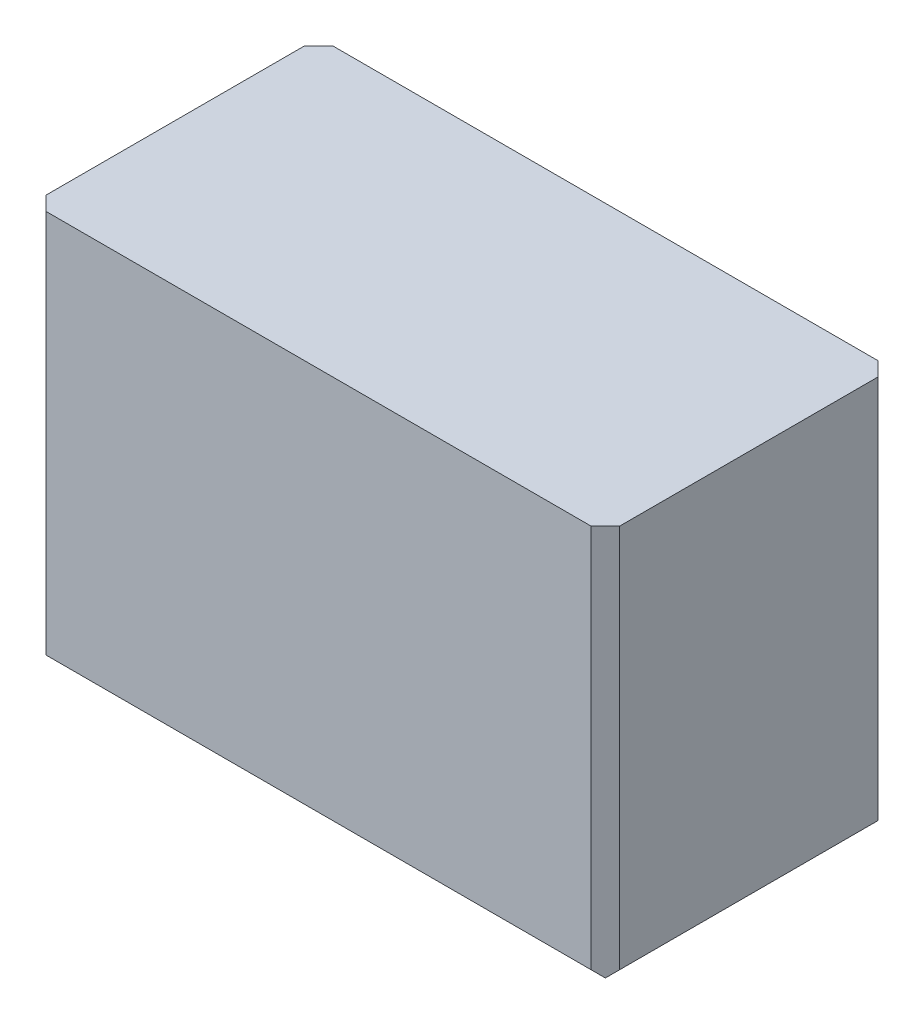
ISO-10303-21;
HEADER;
FILE_DESCRIPTION(('STEP AP214'),'2;1');
FILE_NAME('part.step','',(''),(''),'','','');
FILE_SCHEMA(('AUTOMOTIVE_DESIGN { 1 0 10303 214 1 1 1 1 }'));
ENDSEC;
DATA;
#1=APPLICATION_CONTEXT('core data for automotive mechanical design processes');
#2=APPLICATION_PROTOCOL_DEFINITION('international standard','automotive_design',2000,#1);
#3=PRODUCT_CONTEXT('',#1,'mechanical');
#4=PRODUCT('Part','Part','',(#3));
#5=PRODUCT_RELATED_PRODUCT_CATEGORY('part','',(#4));
#6=PRODUCT_DEFINITION_FORMATION('','',#4);
#7=PRODUCT_DEFINITION_CONTEXT('part definition',#1,'design');
#8=PRODUCT_DEFINITION('design','',#6,#7);
#9=PRODUCT_DEFINITION_SHAPE('','',#8);
#10=(LENGTH_UNIT() NAMED_UNIT(*) SI_UNIT(.MILLI.,.METRE.));
#11=(NAMED_UNIT(*) PLANE_ANGLE_UNIT() SI_UNIT($,.RADIAN.));
#12=(NAMED_UNIT(*) SI_UNIT($,.STERADIAN.) SOLID_ANGLE_UNIT());
#13=UNCERTAINTY_MEASURE_WITH_UNIT(LENGTH_MEASURE(1.E-05),#10,'distance_accuracy_value','');
#14=(GEOMETRIC_REPRESENTATION_CONTEXT(3) GLOBAL_UNCERTAINTY_ASSIGNED_CONTEXT((#13)) GLOBAL_UNIT_ASSIGNED_CONTEXT((#10,
#11,#12)) REPRESENTATION_CONTEXT('',''));
#15=CARTESIAN_POINT('',(0.,0.,0.));
#16=DIRECTION('',(0.,0.,1.));
#17=DIRECTION('',(1.,0.,0.));
#18=AXIS2_PLACEMENT_3D('',#15,#16,#17);
#19=CARTESIAN_POINT('',(20.,13.9,20.));
#20=DIRECTION('',(-1.,0.,0.));
#21=DIRECTION('',(0.,-1.,0.));
#22=AXIS2_PLACEMENT_3D('',#19,#20,#21);
#23=PLANE('',#22);
#24=DIRECTION('',(0.,0.,-1.));
#25=VECTOR('',#24,1.);
#26=CARTESIAN_POINT('',(20.,-12.9,20.));
#27=LINE('',#26,#25);
#28=CARTESIAN_POINT('',(20.,-12.9,19.));
#29=VERTEX_POINT('',#28);
#30=CARTESIAN_POINT('',(20.,-12.9,0.999999999999999));
#31=VERTEX_POINT('',#30);
#32=EDGE_CURVE('E139',#29,#31,#27,.T.);
#33=ORIENTED_EDGE('',*,*,#32,.T.);
#34=DIRECTION('',(0.,1.,0.));
#35=VECTOR('',#34,1.);
#36=CARTESIAN_POINT('',(20.,13.9,1.));
#37=LINE('',#36,#35);
#38=CARTESIAN_POINT('',(20.,13.9,0.999999999999998));
#39=VERTEX_POINT('',#38);
#40=EDGE_CURVE('E163',#31,#39,#37,.T.);
#41=ORIENTED_EDGE('',*,*,#40,.T.);
#42=DIRECTION('',(0.,0.,-1.));
#43=VECTOR('',#42,1.);
#44=CARTESIAN_POINT('',(20.,13.9,20.));
#45=LINE('',#44,#43);
#46=CARTESIAN_POINT('',(20.,13.9,19.));
#47=VERTEX_POINT('',#46);
#48=EDGE_CURVE('E224',#47,#39,#45,.T.);
#49=ORIENTED_EDGE('',*,*,#48,.F.);
#50=DIRECTION('',(0.,-1.,0.));
#51=VECTOR('',#50,1.);
#52=CARTESIAN_POINT('',(20.,-12.9,19.));
#53=LINE('',#52,#51);
#54=EDGE_CURVE('E161',#47,#29,#53,.T.);
#55=ORIENTED_EDGE('',*,*,#54,.T.);
#56=EDGE_LOOP('',(#33,#41,#49,#55));
#57=FACE_BOUND('',#56,.T.);
#58=ADVANCED_FACE('F35',(#57),#23,.F.);
#59=CARTESIAN_POINT('',(-20.,13.9,20.));
#60=DIRECTION('',(0.,-1.,0.));
#61=DIRECTION('',(0.,0.,-1.));
#62=AXIS2_PLACEMENT_3D('',#59,#60,#61);
#63=PLANE('',#62);
#64=ORIENTED_EDGE('',*,*,#48,.T.);
#65=DIRECTION('',(0.707106781186549,0.,0.707106781186546));
#66=VECTOR('',#65,1.);
#67=CARTESIAN_POINT('',(20.,13.9,1.));
#68=LINE('',#67,#66);
#69=CARTESIAN_POINT('',(19.,13.9,0.));
#70=VERTEX_POINT('',#69);
#71=EDGE_CURVE('E172',#39,#70,#68,.F.);
#72=ORIENTED_EDGE('',*,*,#71,.T.);
#73=DIRECTION('',(-1.,0.,0.));
#74=VECTOR('',#73,1.);
#75=CARTESIAN_POINT('',(-20.,13.9,0.));
#76=LINE('',#75,#74);
#77=CARTESIAN_POINT('',(-19.,13.9,0.));
#78=VERTEX_POINT('',#77);
#79=EDGE_CURVE('E235',#70,#78,#76,.T.);
#80=ORIENTED_EDGE('',*,*,#79,.T.);
#81=DIRECTION('',(0.707106781186546,0.,-0.707106781186549));
#82=VECTOR('',#81,1.);
#83=CARTESIAN_POINT('',(-20.,13.9,1.));
#84=LINE('',#83,#82);
#85=CARTESIAN_POINT('',(-20.,13.9,0.999999999999998));
#86=VERTEX_POINT('',#85);
#87=EDGE_CURVE('E166',#78,#86,#84,.F.);
#88=ORIENTED_EDGE('',*,*,#87,.T.);
#89=DIRECTION('',(0.,0.,-1.));
#90=VECTOR('',#89,1.);
#91=CARTESIAN_POINT('',(-20.,13.9,20.));
#92=LINE('',#91,#90);
#93=CARTESIAN_POINT('',(-20.,13.9,19.));
#94=VERTEX_POINT('',#93);
#95=EDGE_CURVE('E201',#94,#86,#92,.T.);
#96=ORIENTED_EDGE('',*,*,#95,.F.);
#97=DIRECTION('',(0.707106781186543,0.,0.707106781186552));
#98=VECTOR('',#97,1.);
#99=CARTESIAN_POINT('',(-19.,13.9,20.));
#100=LINE('',#99,#98);
#101=CARTESIAN_POINT('',(-19.,13.9,20.));
#102=VERTEX_POINT('',#101);
#103=EDGE_CURVE('E168',#94,#102,#100,.T.);
#104=ORIENTED_EDGE('',*,*,#103,.T.);
#105=DIRECTION('',(-1.,0.,0.));
#106=VECTOR('',#105,1.);
#107=CARTESIAN_POINT('',(-20.,13.9,20.));
#108=LINE('',#107,#106);
#109=CARTESIAN_POINT('',(19.,13.9,20.));
#110=VERTEX_POINT('',#109);
#111=EDGE_CURVE('E232',#110,#102,#108,.T.);
#112=ORIENTED_EDGE('',*,*,#111,.F.);
#113=DIRECTION('',(0.707106781186547,0.,-0.707106781186548));
#114=VECTOR('',#113,1.);
#115=CARTESIAN_POINT('',(19.,13.9,20.));
#116=LINE('',#115,#114);
#117=EDGE_CURVE('E170',#110,#47,#116,.T.);
#118=ORIENTED_EDGE('',*,*,#117,.T.);
#119=EDGE_LOOP('',(#64,#72,#80,#88,#96,#104,#112,#118));
#120=FACE_BOUND('',#119,.T.);
#121=ADVANCED_FACE('F227',(#120),#63,.F.);
#122=CARTESIAN_POINT('',(-20.,13.9,20.));
#123=DIRECTION('',(1.,0.,0.));
#124=DIRECTION('',(0.,1.,0.));
#125=AXIS2_PLACEMENT_3D('',#122,#123,#124);
#126=PLANE('',#125);
#127=DIRECTION('',(0.,0.,1.));
#128=VECTOR('',#127,1.);
#129=CARTESIAN_POINT('',(-20.,-12.9,20.));
#130=LINE('',#129,#128);
#131=CARTESIAN_POINT('',(-20.,-12.9,1.00000000000001));
#132=VERTEX_POINT('',#131);
#133=CARTESIAN_POINT('',(-20.,-12.9,19.));
#134=VERTEX_POINT('',#133);
#135=EDGE_CURVE('E145',#132,#134,#130,.T.);
#136=ORIENTED_EDGE('',*,*,#135,.T.);
#137=DIRECTION('',(0.,1.,0.));
#138=VECTOR('',#137,1.);
#139=CARTESIAN_POINT('',(-20.,13.9,19.));
#140=LINE('',#139,#138);
#141=EDGE_CURVE('E11',#134,#94,#140,.T.);
#142=ORIENTED_EDGE('',*,*,#141,.T.);
#143=ORIENTED_EDGE('',*,*,#95,.T.);
#144=DIRECTION('',(0.,-1.,0.));
#145=VECTOR('',#144,1.);
#146=CARTESIAN_POINT('',(-20.,13.9,1.));
#147=LINE('',#146,#145);
#148=EDGE_CURVE('E43',#86,#132,#147,.T.);
#149=ORIENTED_EDGE('',*,*,#148,.T.);
#150=EDGE_LOOP('',(#136,#142,#143,#149));
#151=FACE_BOUND('',#150,.T.);
#152=ADVANCED_FACE('F198',(#151),#126,.F.);
#153=CARTESIAN_POINT('',(-20.,-13.9,20.));
#154=DIRECTION('',(0.,1.,0.));
#155=DIRECTION('',(0.,0.,1.));
#156=AXIS2_PLACEMENT_3D('',#153,#154,#155);
#157=PLANE('',#156);
#158=DIRECTION('',(0.,0.,-1.));
#159=VECTOR('',#158,1.);
#160=CARTESIAN_POINT('',(-19.,-13.9,20.));
#161=LINE('',#160,#159);
#162=CARTESIAN_POINT('',(-19.,-13.9,19.));
#163=VERTEX_POINT('',#162);
#164=CARTESIAN_POINT('',(-19.,-13.9,1.));
#165=VERTEX_POINT('',#164);
#166=EDGE_CURVE('E131',#163,#165,#161,.T.);
#167=ORIENTED_EDGE('',*,*,#166,.T.);
#168=DIRECTION('',(1.,0.,0.));
#169=VECTOR('',#168,1.);
#170=CARTESIAN_POINT('',(-20.,-13.9,1.));
#171=LINE('',#170,#169);
#172=CARTESIAN_POINT('',(19.,-13.9,1.));
#173=VERTEX_POINT('',#172);
#174=EDGE_CURVE('E138',#165,#173,#171,.T.);
#175=ORIENTED_EDGE('',*,*,#174,.T.);
#176=DIRECTION('',(0.,0.,1.));
#177=VECTOR('',#176,1.);
#178=CARTESIAN_POINT('',(19.,-13.9,20.));
#179=LINE('',#178,#177);
#180=CARTESIAN_POINT('',(19.,-13.9,19.));
#181=VERTEX_POINT('',#180);
#182=EDGE_CURVE('E134',#173,#181,#179,.T.);
#183=ORIENTED_EDGE('',*,*,#182,.T.);
#184=DIRECTION('',(-1.,0.,0.));
#185=VECTOR('',#184,1.);
#186=CARTESIAN_POINT('',(-19.,-13.9,19.));
#187=LINE('',#186,#185);
#188=EDGE_CURVE('E127',#181,#163,#187,.T.);
#189=ORIENTED_EDGE('',*,*,#188,.T.);
#190=EDGE_LOOP('',(#167,#175,#183,#189));
#191=FACE_BOUND('',#190,.T.);
#192=ADVANCED_FACE('F129',(#191),#157,.F.);
#193=CARTESIAN_POINT('',(0.,0.,20.));
#194=DIRECTION('',(0.,0.,1.));
#195=DIRECTION('',(1.,0.,0.));
#196=AXIS2_PLACEMENT_3D('',#193,#194,#195);
#197=PLANE('',#196);
#198=DIRECTION('',(1.,0.,0.));
#199=VECTOR('',#198,1.);
#200=CARTESIAN_POINT('',(19.,-12.9,20.));
#201=LINE('',#200,#199);
#202=CARTESIAN_POINT('',(-19.,-12.9,20.));
#203=VERTEX_POINT('',#202);
#204=CARTESIAN_POINT('',(19.,-12.9,20.));
#205=VERTEX_POINT('',#204);
#206=EDGE_CURVE('E152',#203,#205,#201,.T.);
#207=ORIENTED_EDGE('',*,*,#206,.T.);
#208=DIRECTION('',(0.,1.,0.));
#209=VECTOR('',#208,1.);
#210=CARTESIAN_POINT('',(19.,13.9,20.));
#211=LINE('',#210,#209);
#212=EDGE_CURVE('E189',#205,#110,#211,.T.);
#213=ORIENTED_EDGE('',*,*,#212,.T.);
#214=ORIENTED_EDGE('',*,*,#111,.T.);
#215=DIRECTION('',(0.,-1.,0.));
#216=VECTOR('',#215,1.);
#217=CARTESIAN_POINT('',(-19.,-12.9,20.));
#218=LINE('',#217,#216);
#219=EDGE_CURVE('E186',#102,#203,#218,.T.);
#220=ORIENTED_EDGE('',*,*,#219,.T.);
#221=EDGE_LOOP('',(#207,#213,#214,#220));
#222=FACE_BOUND('',#221,.T.);
#223=ADVANCED_FACE('F240',(#222),#197,.T.);
#224=CARTESIAN_POINT('',(0.,0.,0.));
#225=DIRECTION('',(0.,0.,1.));
#226=DIRECTION('',(1.,0.,0.));
#227=AXIS2_PLACEMENT_3D('',#224,#225,#226);
#228=PLANE('',#227);
#229=ORIENTED_EDGE('',*,*,#79,.F.);
#230=DIRECTION('',(0.,-1.,0.));
#231=VECTOR('',#230,1.);
#232=CARTESIAN_POINT('',(19.,0.,0.));
#233=LINE('',#232,#231);
#234=CARTESIAN_POINT('',(19.,-12.9,0.));
#235=VERTEX_POINT('',#234);
#236=EDGE_CURVE('E176',#70,#235,#233,.T.);
#237=ORIENTED_EDGE('',*,*,#236,.T.);
#238=DIRECTION('',(-1.,0.,0.));
#239=VECTOR('',#238,1.);
#240=CARTESIAN_POINT('',(0.,-12.9,0.));
#241=LINE('',#240,#239);
#242=CARTESIAN_POINT('',(-19.,-12.9,0.));
#243=VERTEX_POINT('',#242);
#244=EDGE_CURVE('E150',#235,#243,#241,.T.);
#245=ORIENTED_EDGE('',*,*,#244,.T.);
#246=DIRECTION('',(0.,1.,0.));
#247=VECTOR('',#246,1.);
#248=CARTESIAN_POINT('',(-19.,0.,0.));
#249=LINE('',#248,#247);
#250=EDGE_CURVE('E174',#243,#78,#249,.T.);
#251=ORIENTED_EDGE('',*,*,#250,.T.);
#252=EDGE_LOOP('',(#229,#237,#245,#251));
#253=FACE_BOUND('',#252,.T.);
#254=ADVANCED_FACE('F247',(#253),#228,.F.);
#255=CARTESIAN_POINT('',(-19.,-13.9,20.));
#256=DIRECTION('',(0.70710678118655,0.707106781186545,0.));
#257=DIRECTION('',(0.,0.,-1.));
#258=AXIS2_PLACEMENT_3D('',#255,#256,#257);
#259=PLANE('',#258);
#260=DIRECTION('',(0.577350269189623,-0.577350269189627,-0.577350269189627));
#261=VECTOR('',#260,1.);
#262=CARTESIAN_POINT('',(-19.3333333333333,-13.5666666666667,19.3333333333333));
#263=LINE('',#262,#261);
#264=CARTESIAN_POINT('',(-19.5,-13.4,19.5));
#265=VERTEX_POINT('',#264);
#266=EDGE_CURVE('E142',#163,#265,#263,.F.);
#267=ORIENTED_EDGE('',*,*,#266,.T.);
#268=DIRECTION('',(0.577350269189622,-0.577350269189626,0.577350269189629));
#269=VECTOR('',#268,1.);
#270=CARTESIAN_POINT('',(-19.,-13.9,20.));
#271=LINE('',#270,#269);
#272=EDGE_CURVE('E50',#265,#134,#271,.F.);
#273=ORIENTED_EDGE('',*,*,#272,.T.);
#274=ORIENTED_EDGE('',*,*,#135,.F.);
#275=DIRECTION('',(0.577350269189624,-0.577350269189628,-0.577350269189626));
#276=VECTOR('',#275,1.);
#277=CARTESIAN_POINT('',(-25.6666666666666,-7.23333333333331,6.66666666666668));
#278=LINE('',#277,#276);
#279=CARTESIAN_POINT('',(-19.5,-13.4,0.499999999999998));
#280=VERTEX_POINT('',#279);
#281=EDGE_CURVE('E58',#132,#280,#278,.T.);
#282=ORIENTED_EDGE('',*,*,#281,.T.);
#283=DIRECTION('',(0.577350269189623,-0.577350269189627,0.577350269189627));
#284=VECTOR('',#283,1.);
#285=CARTESIAN_POINT('',(-12.6666666666667,-20.2333333333334,7.33333333333336));
#286=LINE('',#285,#284);
#287=EDGE_CURVE('E144',#280,#165,#286,.T.);
#288=ORIENTED_EDGE('',*,*,#287,.T.);
#289=ORIENTED_EDGE('',*,*,#166,.F.);
#290=EDGE_LOOP('',(#267,#273,#274,#282,#288,#289));
#291=FACE_BOUND('',#290,.T.);
#292=ADVANCED_FACE('F141',(#291),#259,.F.);
#293=CARTESIAN_POINT('',(20.,-12.9,20.));
#294=DIRECTION('',(-0.707106781186545,0.70710678118655,0.));
#295=DIRECTION('',(0.,0.,-1.));
#296=AXIS2_PLACEMENT_3D('',#293,#294,#295);
#297=PLANE('',#296);
#298=DIRECTION('',(0.577350269189628,0.577350269189625,-0.577350269189625));
#299=VECTOR('',#298,1.);
#300=CARTESIAN_POINT('',(13.3333333333333,-19.5666666666666,6.66666666666663));
#301=LINE('',#300,#299);
#302=CARTESIAN_POINT('',(19.5,-13.4,0.499999999999999));
#303=VERTEX_POINT('',#302);
#304=EDGE_CURVE('E155',#173,#303,#301,.T.);
#305=ORIENTED_EDGE('',*,*,#304,.T.);
#306=DIRECTION('',(0.577350269189628,0.577350269189624,0.577350269189625));
#307=VECTOR('',#306,1.);
#308=CARTESIAN_POINT('',(26.3333333333334,-6.56666666666669,7.33333333333332));
#309=LINE('',#308,#307);
#310=EDGE_CURVE('E184',#303,#31,#309,.T.);
#311=ORIENTED_EDGE('',*,*,#310,.T.);
#312=ORIENTED_EDGE('',*,*,#32,.F.);
#313=DIRECTION('',(0.577350269189627,0.577350269189623,-0.577350269189628));
#314=VECTOR('',#313,1.);
#315=CARTESIAN_POINT('',(19.6666666666667,-13.2333333333333,19.3333333333333));
#316=LINE('',#315,#314);
#317=CARTESIAN_POINT('',(19.5,-13.4,19.5));
#318=VERTEX_POINT('',#317);
#319=EDGE_CURVE('E182',#29,#318,#316,.F.);
#320=ORIENTED_EDGE('',*,*,#319,.T.);
#321=DIRECTION('',(0.577350269189628,0.577350269189625,0.577350269189625));
#322=VECTOR('',#321,1.);
#323=CARTESIAN_POINT('',(20.,-12.9,20.));
#324=LINE('',#323,#322);
#325=EDGE_CURVE('E209',#318,#181,#324,.F.);
#326=ORIENTED_EDGE('',*,*,#325,.T.);
#327=ORIENTED_EDGE('',*,*,#182,.F.);
#328=EDGE_LOOP('',(#305,#311,#312,#320,#326,#327));
#329=FACE_BOUND('',#328,.T.);
#330=ADVANCED_FACE('F213',(#329),#297,.F.);
#331=CARTESIAN_POINT('',(-20.,-13.9,1.));
#332=DIRECTION('',(0.,0.707106781186547,0.707106781186547));
#333=DIRECTION('',(1.,0.,0.));
#334=AXIS2_PLACEMENT_3D('',#331,#332,#333);
#335=PLANE('',#334);
#336=ORIENTED_EDGE('',*,*,#244,.F.);
#337=DIRECTION('',(0.577350269189628,-0.577350269189625,0.577350269189625));
#338=VECTOR('',#337,1.);
#339=CARTESIAN_POINT('',(6.66666666666657,-0.566666666666646,-12.3333333333334));
#340=LINE('',#339,#338);
#341=EDGE_CURVE('E180',#235,#303,#340,.T.);
#342=ORIENTED_EDGE('',*,*,#341,.T.);
#343=ORIENTED_EDGE('',*,*,#304,.F.);
#344=ORIENTED_EDGE('',*,*,#174,.F.);
#345=ORIENTED_EDGE('',*,*,#287,.F.);
#346=DIRECTION('',(0.577350269189624,0.577350269189627,-0.577350269189627));
#347=VECTOR('',#346,1.);
#348=CARTESIAN_POINT('',(-20.,-13.9,1.));
#349=LINE('',#348,#347);
#350=EDGE_CURVE('E178',#280,#243,#349,.T.);
#351=ORIENTED_EDGE('',*,*,#350,.T.);
#352=EDGE_LOOP('',(#336,#342,#343,#344,#345,#351));
#353=FACE_BOUND('',#352,.T.);
#354=ADVANCED_FACE('F249',(#353),#335,.F.);
#355=CARTESIAN_POINT('',(0.,-12.9,20.));
#356=DIRECTION('',(0.,-0.707106781186547,0.707106781186547));
#357=DIRECTION('',(-1.,0.,0.));
#358=AXIS2_PLACEMENT_3D('',#355,#356,#357);
#359=PLANE('',#358);
#360=ORIENTED_EDGE('',*,*,#325,.F.);
#361=DIRECTION('',(-0.577350269189625,0.577350269189626,0.577350269189626));
#362=VECTOR('',#361,1.);
#363=CARTESIAN_POINT('',(12.6666666666667,-6.56666666666667,26.3333333333333));
#364=LINE('',#363,#362);
#365=EDGE_CURVE('E193',#318,#205,#364,.T.);
#366=ORIENTED_EDGE('',*,*,#365,.T.);
#367=ORIENTED_EDGE('',*,*,#206,.F.);
#368=DIRECTION('',(-0.577350269189621,-0.577350269189628,-0.577350269189628));
#369=VECTOR('',#368,1.);
#370=CARTESIAN_POINT('',(-12.6666666666668,-6.56666666666669,26.3333333333333));
#371=LINE('',#370,#369);
#372=EDGE_CURVE('E149',#203,#265,#371,.T.);
#373=ORIENTED_EDGE('',*,*,#372,.T.);
#374=ORIENTED_EDGE('',*,*,#266,.F.);
#375=ORIENTED_EDGE('',*,*,#188,.F.);
#376=EDGE_LOOP('',(#360,#366,#367,#373,#374,#375));
#377=FACE_BOUND('',#376,.T.);
#378=ADVANCED_FACE('F147',(#377),#359,.T.);
#379=CARTESIAN_POINT('',(20.,13.9,1.));
#380=DIRECTION('',(-0.707106781186546,0.,0.707106781186549));
#381=DIRECTION('',(0.,1.,0.));
#382=AXIS2_PLACEMENT_3D('',#379,#380,#381);
#383=PLANE('',#382);
#384=ORIENTED_EDGE('',*,*,#341,.F.);
#385=ORIENTED_EDGE('',*,*,#236,.F.);
#386=ORIENTED_EDGE('',*,*,#71,.F.);
#387=ORIENTED_EDGE('',*,*,#40,.F.);
#388=ORIENTED_EDGE('',*,*,#310,.F.);
#389=EDGE_LOOP('',(#384,#385,#386,#387,#388));
#390=FACE_BOUND('',#389,.T.);
#391=ADVANCED_FACE('F219',(#390),#383,.F.);
#392=CARTESIAN_POINT('',(19.,0.,20.));
#393=DIRECTION('',(0.707106781186548,0.,0.707106781186547));
#394=DIRECTION('',(0.,-1.,0.));
#395=AXIS2_PLACEMENT_3D('',#392,#393,#394);
#396=PLANE('',#395);
#397=ORIENTED_EDGE('',*,*,#319,.F.);
#398=ORIENTED_EDGE('',*,*,#54,.F.);
#399=ORIENTED_EDGE('',*,*,#117,.F.);
#400=ORIENTED_EDGE('',*,*,#212,.F.);
#401=ORIENTED_EDGE('',*,*,#365,.F.);
#402=EDGE_LOOP('',(#397,#398,#399,#400,#401));
#403=FACE_BOUND('',#402,.T.);
#404=ADVANCED_FACE('F323',(#403),#396,.T.);
#405=CARTESIAN_POINT('',(-19.,0.,20.));
#406=DIRECTION('',(-0.707106781186552,0.,0.707106781186543));
#407=DIRECTION('',(0.,1.,0.));
#408=AXIS2_PLACEMENT_3D('',#405,#406,#407);
#409=PLANE('',#408);
#410=ORIENTED_EDGE('',*,*,#103,.F.);
#411=ORIENTED_EDGE('',*,*,#141,.F.);
#412=ORIENTED_EDGE('',*,*,#272,.F.);
#413=ORIENTED_EDGE('',*,*,#372,.F.);
#414=ORIENTED_EDGE('',*,*,#219,.F.);
#415=EDGE_LOOP('',(#410,#411,#412,#413,#414));
#416=FACE_BOUND('',#415,.T.);
#417=ADVANCED_FACE('F244',(#416),#409,.T.);
#418=CARTESIAN_POINT('',(-20.,13.9,1.));
#419=DIRECTION('',(0.707106781186549,0.,0.707106781186546));
#420=DIRECTION('',(0.,-1.,0.));
#421=AXIS2_PLACEMENT_3D('',#418,#419,#420);
#422=PLANE('',#421);
#423=ORIENTED_EDGE('',*,*,#87,.F.);
#424=ORIENTED_EDGE('',*,*,#250,.F.);
#425=ORIENTED_EDGE('',*,*,#350,.F.);
#426=ORIENTED_EDGE('',*,*,#281,.F.);
#427=ORIENTED_EDGE('',*,*,#148,.F.);
#428=EDGE_LOOP('',(#423,#424,#425,#426,#427));
#429=FACE_BOUND('',#428,.T.);
#430=ADVANCED_FACE('F37',(#429),#422,.F.);
#431=CLOSED_SHELL('',(#58,#121,#152,#192,#223,#254,#292,#330,#354,#378,#391,#404,#417,#430));
#432=MANIFOLD_SOLID_BREP('B2',#431);
#433=ADVANCED_BREP_SHAPE_REPRESENTATION('',(#18,#432),#14);
#434=SHAPE_DEFINITION_REPRESENTATION(#9,#433);
ENDSEC;
END-ISO-10303-21;
